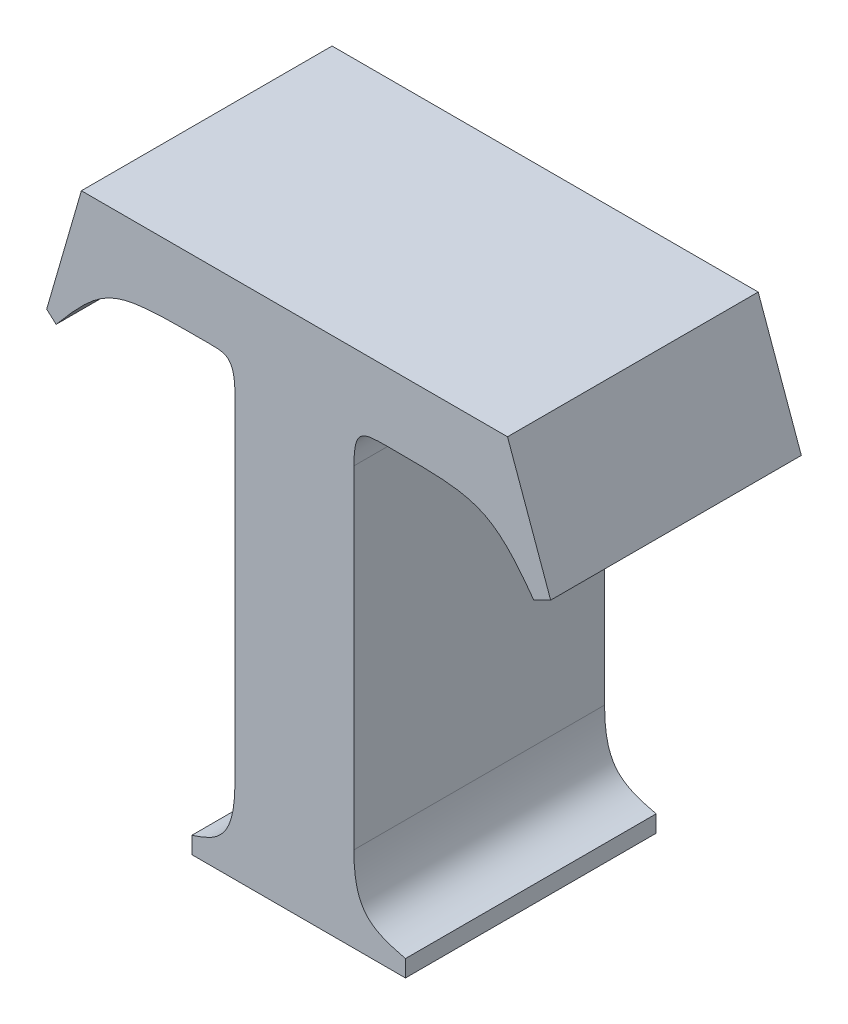
ISO-10303-21;
HEADER;
FILE_DESCRIPTION(('STEP AP214'),'2;1');
FILE_NAME('part.step','',(''),(''),'','','');
FILE_SCHEMA(('AUTOMOTIVE_DESIGN { 1 0 10303 214 1 1 1 1 }'));
ENDSEC;
DATA;
#1=APPLICATION_CONTEXT('core data for automotive mechanical design processes');
#2=APPLICATION_PROTOCOL_DEFINITION('international standard','automotive_design',2000,#1);
#3=PRODUCT_CONTEXT('',#1,'mechanical');
#4=PRODUCT('Part','Part','',(#3));
#5=PRODUCT_RELATED_PRODUCT_CATEGORY('part','',(#4));
#6=PRODUCT_DEFINITION_FORMATION('','',#4);
#7=PRODUCT_DEFINITION_CONTEXT('part definition',#1,'design');
#8=PRODUCT_DEFINITION('design','',#6,#7);
#9=PRODUCT_DEFINITION_SHAPE('','',#8);
#10=(LENGTH_UNIT() NAMED_UNIT(*) SI_UNIT(.MILLI.,.METRE.));
#11=(NAMED_UNIT(*) PLANE_ANGLE_UNIT() SI_UNIT($,.RADIAN.));
#12=(NAMED_UNIT(*) SI_UNIT($,.STERADIAN.) SOLID_ANGLE_UNIT());
#13=UNCERTAINTY_MEASURE_WITH_UNIT(LENGTH_MEASURE(1.E-05),#10,'distance_accuracy_value','');
#14=(GEOMETRIC_REPRESENTATION_CONTEXT(3) GLOBAL_UNCERTAINTY_ASSIGNED_CONTEXT((#13)) GLOBAL_UNIT_ASSIGNED_CONTEXT((#10,
#11,#12)) REPRESENTATION_CONTEXT('',''));
#15=CARTESIAN_POINT('',(0.,0.,0.));
#16=DIRECTION('',(0.,0.,1.));
#17=DIRECTION('',(1.,0.,0.));
#18=AXIS2_PLACEMENT_3D('',#15,#16,#17);
#19=CARTESIAN_POINT('',(2.798055078301,-0.28051607931998,0.));
#20=CARTESIAN_POINT('',(2.798055078301,-0.28051607931998,0.1));
#21=CARTESIAN_POINT('',(2.832051957863,-0.28051607931998,0.));
#22=CARTESIAN_POINT('',(2.832051957863,-0.28051607931998,0.1));
#23=CARTESIAN_POINT('',(2.838767232963,-0.28051607931998,0.));
#24=CARTESIAN_POINT('',(2.838767232963,-0.28051607931998,0.1));
#25=CARTESIAN_POINT('',(2.855976392692,-0.304439952646,0.));
#26=CARTESIAN_POINT('',(2.855976392692,-0.304439952646,0.1));
#27=B_SPLINE_SURFACE_WITH_KNOTS('',3,1,((#19,#20),(#21,#22),(#23,#24),(#25,#26)),.UNSPECIFIED.,
.F.,.F.,.F.,(4,4),(2,2),(-1.,0.),(0.,0.01),.UNSPECIFIED.);
#28=CARTESIAN_POINT('',(2.855976392692,-0.304439952646,0.));
#29=CARTESIAN_POINT('',(2.838767232963,-0.28051607931998,0.));
#30=CARTESIAN_POINT('',(2.832051957863,-0.28051607931998,0.));
#31=CARTESIAN_POINT('',(2.798055078301,-0.28051607931998,0.));
#32=B_SPLINE_CURVE_WITH_KNOTS('',3,(#28,#29,#30,#31),.UNSPECIFIED.,.F.,.F.,(4,4),(0.,1.),.UNSPECIFIED.);
#33=CARTESIAN_POINT('',(2.855976392692,-0.304439952646,0.));
#34=VERTEX_POINT('',#33);
#35=CARTESIAN_POINT('',(2.798055078301,-0.28051607931998,0.));
#36=VERTEX_POINT('',#35);
#37=EDGE_CURVE('E11',#34,#36,#32,.T.);
#38=DIRECTION('',(0.,0.,1.));
#39=VECTOR('',#38,1.);
#40=CARTESIAN_POINT('',(2.855976392692,-0.304439952646,0.));
#41=LINE('',#40,#39);
#42=CARTESIAN_POINT('',(2.855976392692,-0.304439952646,0.1));
#43=VERTEX_POINT('',#42);
#44=EDGE_CURVE('E28',#34,#43,#41,.T.);
#45=CARTESIAN_POINT('',(2.798055078301,-0.28051607931998,0.1));
#46=CARTESIAN_POINT('',(2.832051957863,-0.28051607931998,0.1));
#47=CARTESIAN_POINT('',(2.838767232963,-0.28051607931998,0.1));
#48=CARTESIAN_POINT('',(2.855976392692,-0.304439952646,0.1));
#49=B_SPLINE_CURVE_WITH_KNOTS('',3,(#45,#46,#47,#48),.UNSPECIFIED.,.F.,.F.,(4,4),(-1.,0.),.UNSPECIFIED.);
#50=CARTESIAN_POINT('',(2.798055078301,-0.28051607931998,0.1));
#51=VERTEX_POINT('',#50);
#52=EDGE_CURVE('E152',#51,#43,#49,.T.);
#53=DIRECTION('',(0.,0.,1.));
#54=VECTOR('',#53,1.);
#55=CARTESIAN_POINT('',(2.798055078301,-0.28051607931998,0.));
#56=LINE('',#55,#54);
#57=EDGE_CURVE('E304',#36,#51,#56,.T.);
#58=ORIENTED_EDGE('',*,*,#37,.F.);
#59=ORIENTED_EDGE('',*,*,#44,.T.);
#60=ORIENTED_EDGE('',*,*,#52,.F.);
#61=ORIENTED_EDGE('',*,*,#57,.F.);
#62=EDGE_LOOP('',(#58,#59,#60,#61));
#63=FACE_BOUND('',#62,.T.);
#64=ADVANCED_FACE('F17',(#63),#27,.T.);
#65=CARTESIAN_POINT('',(2.784204335989,-0.29394706624691,0.));
#66=CARTESIAN_POINT('',(2.784204335989,-0.29394706624691,0.1));
#67=CARTESIAN_POINT('',(2.784204335989,-0.280516079319981,0.));
#68=CARTESIAN_POINT('',(2.784204335989,-0.280516079319981,0.1));
#69=CARTESIAN_POINT('',(2.78756244146,-0.28051607931998,0.));
#70=CARTESIAN_POINT('',(2.78756244146,-0.28051607931998,0.1));
#71=CARTESIAN_POINT('',(2.798055078301,-0.28051607931998,0.));
#72=CARTESIAN_POINT('',(2.798055078301,-0.28051607931998,0.1));
#73=B_SPLINE_SURFACE_WITH_KNOTS('',3,1,((#65,#66),(#67,#68),(#69,#70),(#71,#72)),.UNSPECIFIED.,
.F.,.F.,.F.,(4,4),(2,2),(-1.,0.),(0.,0.01),.UNSPECIFIED.);
#74=CARTESIAN_POINT('',(2.798055078301,-0.28051607931998,0.));
#75=CARTESIAN_POINT('',(2.78756244146,-0.28051607931998,0.));
#76=CARTESIAN_POINT('',(2.784204335989,-0.280516079319981,0.));
#77=CARTESIAN_POINT('',(2.784204335989,-0.29394706624691,0.));
#78=B_SPLINE_CURVE_WITH_KNOTS('',3,(#74,#75,#76,#77),.UNSPECIFIED.,.F.,.F.,(4,4),(0.,1.),.UNSPECIFIED.);
#79=CARTESIAN_POINT('',(2.784204335989,-0.29394706624691,0.));
#80=VERTEX_POINT('',#79);
#81=EDGE_CURVE('E297',#36,#80,#78,.T.);
#82=CARTESIAN_POINT('',(2.784204335989,-0.29394706624691,0.1));
#83=CARTESIAN_POINT('',(2.784204335989,-0.280516079319981,0.1));
#84=CARTESIAN_POINT('',(2.78756244146,-0.28051607931998,0.1));
#85=CARTESIAN_POINT('',(2.798055078301,-0.28051607931998,0.1));
#86=B_SPLINE_CURVE_WITH_KNOTS('',3,(#82,#83,#84,#85),.UNSPECIFIED.,.F.,.F.,(4,4),(-1.,0.),.UNSPECIFIED.);
#87=CARTESIAN_POINT('',(2.784204335989,-0.29394706624691,0.1));
#88=VERTEX_POINT('',#87);
#89=EDGE_CURVE('E293',#88,#51,#86,.T.);
#90=DIRECTION('',(0.,0.,1.));
#91=VECTOR('',#90,1.);
#92=CARTESIAN_POINT('',(2.784204335989,-0.29394706624691,0.));
#93=LINE('',#92,#91);
#94=EDGE_CURVE('E290',#80,#88,#93,.T.);
#95=ORIENTED_EDGE('',*,*,#81,.F.);
#96=ORIENTED_EDGE('',*,*,#57,.T.);
#97=ORIENTED_EDGE('',*,*,#89,.F.);
#98=ORIENTED_EDGE('',*,*,#94,.F.);
#99=EDGE_LOOP('',(#95,#96,#97,#98));
#100=FACE_BOUND('',#99,.T.);
#101=ADVANCED_FACE('F366',(#100),#73,.T.);
#102=CARTESIAN_POINT('',(2.784204335989,-0.426577508445,0.));
#103=DIRECTION('',(1.,0.,0.));
#104=DIRECTION('',(0.,1.,0.));
#105=AXIS2_PLACEMENT_3D('',#102,#103,#104);
#106=PLANE('',#105);
#107=DIRECTION('',(0.,-1.,0.));
#108=VECTOR('',#107,1.);
#109=CARTESIAN_POINT('',(2.784204335989,-0.29394706624691,0.));
#110=LINE('',#109,#108);
#111=CARTESIAN_POINT('',(2.784204335989,-0.426577508445,0.));
#112=VERTEX_POINT('',#111);
#113=EDGE_CURVE('E288',#80,#112,#110,.T.);
#114=ORIENTED_EDGE('',*,*,#113,.F.);
#115=ORIENTED_EDGE('',*,*,#94,.T.);
#116=DIRECTION('',(0.,1.,0.));
#117=VECTOR('',#116,1.);
#118=CARTESIAN_POINT('',(2.784204335989,-0.29394706624691,0.1));
#119=LINE('',#118,#117);
#120=CARTESIAN_POINT('',(2.784204335989,-0.426577508445,0.1));
#121=VERTEX_POINT('',#120);
#122=EDGE_CURVE('E285',#121,#88,#119,.T.);
#123=ORIENTED_EDGE('',*,*,#122,.F.);
#124=DIRECTION('',(0.,0.,1.));
#125=VECTOR('',#124,1.);
#126=CARTESIAN_POINT('',(2.784204335989,-0.426577508445,0.));
#127=LINE('',#126,#125);
#128=EDGE_CURVE('E279',#112,#121,#127,.T.);
#129=ORIENTED_EDGE('',*,*,#128,.F.);
#130=EDGE_LOOP('',(#114,#115,#123,#129));
#131=FACE_BOUND('',#130,.T.);
#132=ADVANCED_FACE('F362',(#131),#106,.T.);
#133=CARTESIAN_POINT('',(2.804770353402,-0.453859050516,0.));
#134=CARTESIAN_POINT('',(2.804770353402,-0.453859050516,0.1));
#135=CARTESIAN_POINT('',(2.79091961109,-0.450501256992,0.));
#136=CARTESIAN_POINT('',(2.79091961109,-0.450501256992,0.1));
#137=CARTESIAN_POINT('',(2.784204335989,-0.447143557053,0.));
#138=CARTESIAN_POINT('',(2.784204335989,-0.447143557053,0.1));
#139=CARTESIAN_POINT('',(2.784204335989,-0.426577508445,0.));
#140=CARTESIAN_POINT('',(2.784204335989,-0.426577508445,0.1));
#141=B_SPLINE_SURFACE_WITH_KNOTS('',3,1,((#133,#134),(#135,#136),(#137,#138),(#139,#140)),
.UNSPECIFIED.,.F.,.F.,.F.,(4,4),(2,2),(-1.,0.),(0.,0.01),.UNSPECIFIED.);
#142=CARTESIAN_POINT('',(2.784204335989,-0.426577508445,0.));
#143=CARTESIAN_POINT('',(2.784204335989,-0.447143557053,0.));
#144=CARTESIAN_POINT('',(2.79091961109,-0.450501256992,0.));
#145=CARTESIAN_POINT('',(2.804770353402,-0.453859050516,0.));
#146=B_SPLINE_CURVE_WITH_KNOTS('',3,(#142,#143,#144,#145),.UNSPECIFIED.,.F.,.F.,(4,4),(0.,1.),.UNSPECIFIED.);
#147=CARTESIAN_POINT('',(2.804770353402,-0.453859050516,0.));
#148=VERTEX_POINT('',#147);
#149=EDGE_CURVE('E272',#112,#148,#146,.T.);
#150=CARTESIAN_POINT('',(2.804770353402,-0.453859050516,0.1));
#151=CARTESIAN_POINT('',(2.79091961109,-0.450501256992,0.1));
#152=CARTESIAN_POINT('',(2.784204335989,-0.447143557053,0.1));
#153=CARTESIAN_POINT('',(2.784204335989,-0.426577508445,0.1));
#154=B_SPLINE_CURVE_WITH_KNOTS('',3,(#150,#151,#152,#153),.UNSPECIFIED.,.F.,.F.,(4,4),(-1.,0.),.UNSPECIFIED.);
#155=CARTESIAN_POINT('',(2.804770353402,-0.453859050516,0.1));
#156=VERTEX_POINT('',#155);
#157=EDGE_CURVE('E267',#156,#121,#154,.T.);
#158=DIRECTION('',(0.,0.,1.));
#159=VECTOR('',#158,1.);
#160=CARTESIAN_POINT('',(2.804770353402,-0.453859050516,0.));
#161=LINE('',#160,#159);
#162=EDGE_CURVE('E264',#148,#156,#161,.T.);
#163=ORIENTED_EDGE('',*,*,#149,.F.);
#164=ORIENTED_EDGE('',*,*,#128,.T.);
#165=ORIENTED_EDGE('',*,*,#157,.F.);
#166=ORIENTED_EDGE('',*,*,#162,.F.);
#167=EDGE_LOOP('',(#163,#164,#165,#166));
#168=FACE_BOUND('',#167,.T.);
#169=ADVANCED_FACE('F358',(#168),#141,.T.);
#170=CARTESIAN_POINT('',(2.804770353402,-0.46057454398,0.));
#171=DIRECTION('',(1.,0.,0.));
#172=DIRECTION('',(0.,1.,0.));
#173=AXIS2_PLACEMENT_3D('',#170,#171,#172);
#174=PLANE('',#173);
#175=DIRECTION('',(0.,-1.,0.));
#176=VECTOR('',#175,1.);
#177=CARTESIAN_POINT('',(2.804770353402,-0.453859050516,0.));
#178=LINE('',#177,#176);
#179=CARTESIAN_POINT('',(2.804770353402,-0.46057454398,0.));
#180=VERTEX_POINT('',#179);
#181=EDGE_CURVE('E262',#148,#180,#178,.T.);
#182=ORIENTED_EDGE('',*,*,#181,.F.);
#183=ORIENTED_EDGE('',*,*,#162,.T.);
#184=DIRECTION('',(0.,1.,0.));
#185=VECTOR('',#184,1.);
#186=CARTESIAN_POINT('',(2.804770353402,-0.453859050516,0.1));
#187=LINE('',#186,#185);
#188=CARTESIAN_POINT('',(2.804770353402,-0.46057454398,0.1));
#189=VERTEX_POINT('',#188);
#190=EDGE_CURVE('E259',#189,#156,#187,.T.);
#191=ORIENTED_EDGE('',*,*,#190,.F.);
#192=DIRECTION('',(0.,0.,1.));
#193=VECTOR('',#192,1.);
#194=CARTESIAN_POINT('',(2.804770353402,-0.46057454398,0.));
#195=LINE('',#194,#193);
#196=EDGE_CURVE('E256',#180,#189,#195,.T.);
#197=ORIENTED_EDGE('',*,*,#196,.F.);
#198=EDGE_LOOP('',(#182,#183,#191,#197));
#199=FACE_BOUND('',#198,.T.);
#200=ADVANCED_FACE('F354',(#199),#174,.T.);
#201=CARTESIAN_POINT('',(2.719568682337,-0.46057454398,0.));
#202=DIRECTION('',(0.,-1.,0.));
#203=DIRECTION('',(1.,0.,0.));
#204=AXIS2_PLACEMENT_3D('',#201,#202,#203);
#205=PLANE('',#204);
#206=DIRECTION('',(-1.,0.,0.));
#207=VECTOR('',#206,1.);
#208=CARTESIAN_POINT('',(2.804770353402,-0.46057454398,0.));
#209=LINE('',#208,#207);
#210=CARTESIAN_POINT('',(2.719568682337,-0.46057454398,0.));
#211=VERTEX_POINT('',#210);
#212=EDGE_CURVE('E254',#180,#211,#209,.T.);
#213=ORIENTED_EDGE('',*,*,#212,.F.);
#214=ORIENTED_EDGE('',*,*,#196,.T.);
#215=DIRECTION('',(1.,0.,0.));
#216=VECTOR('',#215,1.);
#217=CARTESIAN_POINT('',(2.804770353402,-0.46057454398,0.1));
#218=LINE('',#217,#216);
#219=CARTESIAN_POINT('',(2.719568682337,-0.46057454398,0.1));
#220=VERTEX_POINT('',#219);
#221=EDGE_CURVE('E251',#220,#189,#218,.T.);
#222=ORIENTED_EDGE('',*,*,#221,.F.);
#223=DIRECTION('',(0.,0.,1.));
#224=VECTOR('',#223,1.);
#225=CARTESIAN_POINT('',(2.719568682337,-0.46057454398,0.));
#226=LINE('',#225,#224);
#227=EDGE_CURVE('E248',#211,#220,#226,.T.);
#228=ORIENTED_EDGE('',*,*,#227,.F.);
#229=EDGE_LOOP('',(#213,#214,#222,#228));
#230=FACE_BOUND('',#229,.T.);
#231=ADVANCED_FACE('F350',(#230),#205,.T.);
#232=CARTESIAN_POINT('',(2.719568682337,-0.453859050516,0.));
#233=DIRECTION('',(-1.,0.,0.));
#234=DIRECTION('',(0.,-1.,0.));
#235=AXIS2_PLACEMENT_3D('',#232,#233,#234);
#236=PLANE('',#235);
#237=DIRECTION('',(0.,1.,0.));
#238=VECTOR('',#237,1.);
#239=CARTESIAN_POINT('',(2.719568682337,-0.46057454398,0.));
#240=LINE('',#239,#238);
#241=CARTESIAN_POINT('',(2.719568682337,-0.453859050516,0.));
#242=VERTEX_POINT('',#241);
#243=EDGE_CURVE('E246',#211,#242,#240,.T.);
#244=ORIENTED_EDGE('',*,*,#243,.F.);
#245=ORIENTED_EDGE('',*,*,#227,.T.);
#246=DIRECTION('',(0.,-1.,0.));
#247=VECTOR('',#246,1.);
#248=CARTESIAN_POINT('',(2.719568682337,-0.46057454398,0.1));
#249=LINE('',#248,#247);
#250=CARTESIAN_POINT('',(2.719568682337,-0.453859050516,0.1));
#251=VERTEX_POINT('',#250);
#252=EDGE_CURVE('E243',#251,#220,#249,.T.);
#253=ORIENTED_EDGE('',*,*,#252,.F.);
#254=DIRECTION('',(0.,0.,1.));
#255=VECTOR('',#254,1.);
#256=CARTESIAN_POINT('',(2.719568682337,-0.453859050516,0.));
#257=LINE('',#256,#255);
#258=EDGE_CURVE('E237',#242,#251,#257,.T.);
#259=ORIENTED_EDGE('',*,*,#258,.F.);
#260=EDGE_LOOP('',(#244,#245,#253,#259));
#261=FACE_BOUND('',#260,.T.);
#262=ADVANCED_FACE('F346',(#261),#236,.T.);
#263=CARTESIAN_POINT('',(2.73677659428,-0.426577508445,0.));
#264=CARTESIAN_POINT('',(2.73677659428,-0.426577508445,0.1));
#265=CARTESIAN_POINT('',(2.73677659428,-0.447143557053,0.));
#266=CARTESIAN_POINT('',(2.73677659428,-0.447143557053,0.1));
#267=CARTESIAN_POINT('',(2.730061319179,-0.450501256992,0.));
#268=CARTESIAN_POINT('',(2.730061319179,-0.450501256992,0.1));
#269=CARTESIAN_POINT('',(2.719568682337,-0.453859050516,0.));
#270=CARTESIAN_POINT('',(2.719568682337,-0.453859050516,0.1));
#271=B_SPLINE_SURFACE_WITH_KNOTS('',3,1,((#263,#264),(#265,#266),(#267,#268),(#269,#270)),
.UNSPECIFIED.,.F.,.F.,.F.,(4,4),(2,2),(-1.,0.),(0.,0.01),.UNSPECIFIED.);
#272=CARTESIAN_POINT('',(2.719568682337,-0.453859050516,0.));
#273=CARTESIAN_POINT('',(2.730061319179,-0.450501256992,0.));
#274=CARTESIAN_POINT('',(2.73677659428,-0.447143557053,0.));
#275=CARTESIAN_POINT('',(2.73677659428,-0.426577508445,0.));
#276=B_SPLINE_CURVE_WITH_KNOTS('',3,(#272,#273,#274,#275),.UNSPECIFIED.,.F.,.F.,(4,4),(0.,1.),.UNSPECIFIED.);
#277=CARTESIAN_POINT('',(2.73677659428,-0.426577508445,0.));
#278=VERTEX_POINT('',#277);
#279=EDGE_CURVE('E230',#242,#278,#276,.T.);
#280=CARTESIAN_POINT('',(2.73677659428,-0.426577508445,0.1));
#281=CARTESIAN_POINT('',(2.73677659428,-0.447143557053,0.1));
#282=CARTESIAN_POINT('',(2.730061319179,-0.450501256992,0.1));
#283=CARTESIAN_POINT('',(2.719568682337,-0.453859050516,0.1));
#284=B_SPLINE_CURVE_WITH_KNOTS('',3,(#280,#281,#282,#283),.UNSPECIFIED.,.F.,.F.,(4,4),(-1.,0.),.UNSPECIFIED.);
#285=CARTESIAN_POINT('',(2.73677659428,-0.426577508445,0.1));
#286=VERTEX_POINT('',#285);
#287=EDGE_CURVE('E225',#286,#251,#284,.T.);
#288=DIRECTION('',(0.,0.,1.));
#289=VECTOR('',#288,1.);
#290=CARTESIAN_POINT('',(2.73677659428,-0.426577508445,0.));
#291=LINE('',#290,#289);
#292=EDGE_CURVE('E222',#278,#286,#291,.T.);
#293=ORIENTED_EDGE('',*,*,#279,.F.);
#294=ORIENTED_EDGE('',*,*,#258,.T.);
#295=ORIENTED_EDGE('',*,*,#287,.F.);
#296=ORIENTED_EDGE('',*,*,#292,.F.);
#297=EDGE_LOOP('',(#293,#294,#295,#296));
#298=FACE_BOUND('',#297,.T.);
#299=ADVANCED_FACE('F342',(#298),#271,.T.);
#300=CARTESIAN_POINT('',(2.73677659428,-0.29394706624691,0.));
#301=DIRECTION('',(-1.,0.,0.));
#302=DIRECTION('',(0.,-1.,0.));
#303=AXIS2_PLACEMENT_3D('',#300,#301,#302);
#304=PLANE('',#303);
#305=DIRECTION('',(0.,1.,0.));
#306=VECTOR('',#305,1.);
#307=CARTESIAN_POINT('',(2.73677659428,-0.426577508445,0.));
#308=LINE('',#307,#306);
#309=CARTESIAN_POINT('',(2.73677659428,-0.29394706624691,0.));
#310=VERTEX_POINT('',#309);
#311=EDGE_CURVE('E220',#278,#310,#308,.T.);
#312=ORIENTED_EDGE('',*,*,#311,.F.);
#313=ORIENTED_EDGE('',*,*,#292,.T.);
#314=DIRECTION('',(0.,-1.,0.));
#315=VECTOR('',#314,1.);
#316=CARTESIAN_POINT('',(2.73677659428,-0.426577508445,0.1));
#317=LINE('',#316,#315);
#318=CARTESIAN_POINT('',(2.73677659428,-0.29394706624691,0.1));
#319=VERTEX_POINT('',#318);
#320=EDGE_CURVE('E217',#319,#286,#317,.T.);
#321=ORIENTED_EDGE('',*,*,#320,.F.);
#322=DIRECTION('',(0.,0.,1.));
#323=VECTOR('',#322,1.);
#324=CARTESIAN_POINT('',(2.73677659428,-0.29394706624691,0.));
#325=LINE('',#324,#323);
#326=EDGE_CURVE('E211',#310,#319,#325,.T.);
#327=ORIENTED_EDGE('',*,*,#326,.F.);
#328=EDGE_LOOP('',(#312,#313,#321,#327));
#329=FACE_BOUND('',#328,.T.);
#330=ADVANCED_FACE('F338',(#329),#304,.T.);
#331=CARTESIAN_POINT('',(2.726283957438,-0.28051607931998,0.));
#332=CARTESIAN_POINT('',(2.726283957438,-0.28051607931998,0.1));
#333=CARTESIAN_POINT('',(2.733419424649,-0.28051607931998,0.));
#334=CARTESIAN_POINT('',(2.733419424649,-0.28051607931998,0.1));
#335=CARTESIAN_POINT('',(2.73677659428,-0.28051607931998,0.));
#336=CARTESIAN_POINT('',(2.73677659428,-0.28051607931998,0.1));
#337=CARTESIAN_POINT('',(2.73677659428,-0.29394706624691,0.));
#338=CARTESIAN_POINT('',(2.73677659428,-0.29394706624691,0.1));
#339=B_SPLINE_SURFACE_WITH_KNOTS('',3,1,((#331,#332),(#333,#334),(#335,#336),(#337,#338)),
.UNSPECIFIED.,.F.,.F.,.F.,(4,4),(2,2),(-1.,0.),(0.,0.01),.UNSPECIFIED.);
#340=CARTESIAN_POINT('',(2.73677659428,-0.29394706624691,0.));
#341=CARTESIAN_POINT('',(2.73677659428,-0.28051607931998,0.));
#342=CARTESIAN_POINT('',(2.733419424649,-0.28051607931998,0.));
#343=CARTESIAN_POINT('',(2.726283957438,-0.28051607931998,0.));
#344=B_SPLINE_CURVE_WITH_KNOTS('',3,(#340,#341,#342,#343),.UNSPECIFIED.,.F.,.F.,(4,4),(0.,1.),.UNSPECIFIED.);
#345=CARTESIAN_POINT('',(2.726283957438,-0.28051607931998,0.));
#346=VERTEX_POINT('',#345);
#347=EDGE_CURVE('E204',#310,#346,#344,.T.);
#348=CARTESIAN_POINT('',(2.726283957438,-0.28051607931998,0.1));
#349=CARTESIAN_POINT('',(2.733419424649,-0.28051607931998,0.1));
#350=CARTESIAN_POINT('',(2.73677659428,-0.28051607931998,0.1));
#351=CARTESIAN_POINT('',(2.73677659428,-0.29394706624691,0.1));
#352=B_SPLINE_CURVE_WITH_KNOTS('',3,(#348,#349,#350,#351),.UNSPECIFIED.,.F.,.F.,(4,4),(-1.,0.),.UNSPECIFIED.);
#353=CARTESIAN_POINT('',(2.726283957438,-0.28051607931998,0.1));
#354=VERTEX_POINT('',#353);
#355=EDGE_CURVE('E199',#354,#319,#352,.T.);
#356=DIRECTION('',(0.,0.,1.));
#357=VECTOR('',#356,1.);
#358=CARTESIAN_POINT('',(2.726283957438,-0.28051607931998,0.));
#359=LINE('',#358,#357);
#360=EDGE_CURVE('E193',#346,#354,#359,.T.);
#361=ORIENTED_EDGE('',*,*,#347,.F.);
#362=ORIENTED_EDGE('',*,*,#326,.T.);
#363=ORIENTED_EDGE('',*,*,#355,.F.);
#364=ORIENTED_EDGE('',*,*,#360,.F.);
#365=EDGE_LOOP('',(#361,#362,#363,#364));
#366=FACE_BOUND('',#365,.T.);
#367=ADVANCED_FACE('F334',(#366),#339,.T.);
#368=CARTESIAN_POINT('',(2.665424417741,-0.304439952646,0.));
#369=CARTESIAN_POINT('',(2.665424417741,-0.304439952646,0.1));
#370=CARTESIAN_POINT('',(2.685571802776,-0.28051607931998,0.));
#371=CARTESIAN_POINT('',(2.685571802776,-0.28051607931998,0.1));
#372=CARTESIAN_POINT('',(2.688928972407,-0.28051607931998,0.));
#373=CARTESIAN_POINT('',(2.688928972407,-0.28051607931998,0.1));
#374=CARTESIAN_POINT('',(2.726283957438,-0.28051607931998,0.));
#375=CARTESIAN_POINT('',(2.726283957438,-0.28051607931998,0.1));
#376=B_SPLINE_SURFACE_WITH_KNOTS('',3,1,((#368,#369),(#370,#371),(#372,#373),(#374,#375)),
.UNSPECIFIED.,.F.,.F.,.F.,(4,4),(2,2),(-1.,0.),(0.,0.01),.UNSPECIFIED.);
#377=CARTESIAN_POINT('',(2.726283957438,-0.28051607931998,0.));
#378=CARTESIAN_POINT('',(2.688928972407,-0.28051607931998,0.));
#379=CARTESIAN_POINT('',(2.685571802776,-0.28051607931998,0.));
#380=CARTESIAN_POINT('',(2.665424417741,-0.304439952646,0.));
#381=B_SPLINE_CURVE_WITH_KNOTS('',3,(#377,#378,#379,#380),.UNSPECIFIED.,.F.,.F.,(4,4),(0.,1.),.UNSPECIFIED.);
#382=CARTESIAN_POINT('',(2.665424417741,-0.304439952646,0.));
#383=VERTEX_POINT('',#382);
#384=EDGE_CURVE('E186',#346,#383,#381,.T.);
#385=CARTESIAN_POINT('',(2.665424417741,-0.304439952646,0.1));
#386=CARTESIAN_POINT('',(2.685571802776,-0.28051607931998,0.1));
#387=CARTESIAN_POINT('',(2.688928972407,-0.28051607931998,0.1));
#388=CARTESIAN_POINT('',(2.726283957438,-0.28051607931998,0.1));
#389=B_SPLINE_CURVE_WITH_KNOTS('',3,(#385,#386,#387,#388),.UNSPECIFIED.,.F.,.F.,(4,4),(-1.,0.),.UNSPECIFIED.);
#390=CARTESIAN_POINT('',(2.665424417741,-0.304439952646,0.1));
#391=VERTEX_POINT('',#390);
#392=EDGE_CURVE('E181',#391,#354,#389,.T.);
#393=DIRECTION('',(0.,0.,1.));
#394=VECTOR('',#393,1.);
#395=CARTESIAN_POINT('',(2.665424417741,-0.304439952646,0.));
#396=LINE('',#395,#394);
#397=EDGE_CURVE('E178',#383,#391,#396,.T.);
#398=ORIENTED_EDGE('',*,*,#384,.F.);
#399=ORIENTED_EDGE('',*,*,#360,.T.);
#400=ORIENTED_EDGE('',*,*,#392,.F.);
#401=ORIENTED_EDGE('',*,*,#397,.F.);
#402=EDGE_LOOP('',(#398,#399,#400,#401));
#403=FACE_BOUND('',#402,.T.);
#404=ADVANCED_FACE('F330',(#403),#376,.T.);
#405=CARTESIAN_POINT('',(2.661647367946,-0.301082252706,0.));
#406=DIRECTION('',(-0.664399468795153,-0.747377646083102,0.));
#407=DIRECTION('',(0.747377646083102,-0.664399468795153,0.));
#408=AXIS2_PLACEMENT_3D('',#405,#406,#407);
#409=PLANE('',#408);
#410=DIRECTION('',(-0.747377646083102,0.664399468795153,0.));
#411=VECTOR('',#410,1.);
#412=CARTESIAN_POINT('',(2.665424417741,-0.304439952646,0.));
#413=LINE('',#412,#411);
#414=CARTESIAN_POINT('',(2.661647367946,-0.301082252706,0.));
#415=VERTEX_POINT('',#414);
#416=EDGE_CURVE('E176',#383,#415,#413,.T.);
#417=ORIENTED_EDGE('',*,*,#416,.F.);
#418=ORIENTED_EDGE('',*,*,#397,.T.);
#419=DIRECTION('',(0.747377646083102,-0.664399468795153,0.));
#420=VECTOR('',#419,1.);
#421=CARTESIAN_POINT('',(2.665424417741,-0.304439952646,0.1));
#422=LINE('',#421,#420);
#423=CARTESIAN_POINT('',(2.661647367946,-0.301082252706,0.1));
#424=VERTEX_POINT('',#423);
#425=EDGE_CURVE('E173',#424,#391,#422,.T.);
#426=ORIENTED_EDGE('',*,*,#425,.F.);
#427=DIRECTION('',(0.,0.,1.));
#428=VECTOR('',#427,1.);
#429=CARTESIAN_POINT('',(2.661647367946,-0.301082252706,0.));
#430=LINE('',#429,#428);
#431=EDGE_CURVE('E170',#415,#424,#430,.T.);
#432=ORIENTED_EDGE('',*,*,#431,.F.);
#433=EDGE_LOOP('',(#417,#418,#426,#432));
#434=FACE_BOUND('',#433,.T.);
#435=ADVANCED_FACE('F326',(#434),#409,.T.);
#436=CARTESIAN_POINT('',(2.675498110258,-0.25323453724898,0.));
#437=DIRECTION('',(-0.960563793427831,0.278059703580967,0.));
#438=DIRECTION('',(-0.278059703580967,-0.960563793427831,0.));
#439=AXIS2_PLACEMENT_3D('',#436,#437,#438);
#440=PLANE('',#439);
#441=DIRECTION('',(0.278059703580967,0.960563793427831,0.));
#442=VECTOR('',#441,1.);
#443=CARTESIAN_POINT('',(2.661647367946,-0.301082252706,0.));
#444=LINE('',#443,#442);
#445=CARTESIAN_POINT('',(2.675498110258,-0.25323453724898,0.));
#446=VERTEX_POINT('',#445);
#447=EDGE_CURVE('E168',#415,#446,#444,.T.);
#448=ORIENTED_EDGE('',*,*,#447,.F.);
#449=ORIENTED_EDGE('',*,*,#431,.T.);
#450=DIRECTION('',(-0.278059703580967,-0.960563793427831,0.));
#451=VECTOR('',#450,1.);
#452=CARTESIAN_POINT('',(2.661647367946,-0.301082252706,0.1));
#453=LINE('',#452,#451);
#454=CARTESIAN_POINT('',(2.675498110258,-0.25323453724898,0.1));
#455=VERTEX_POINT('',#454);
#456=EDGE_CURVE('E165',#455,#424,#453,.T.);
#457=ORIENTED_EDGE('',*,*,#456,.F.);
#458=DIRECTION('',(0.,0.,1.));
#459=VECTOR('',#458,1.);
#460=CARTESIAN_POINT('',(2.675498110258,-0.25323453724898,0.));
#461=LINE('',#460,#459);
#462=EDGE_CURVE('E162',#446,#455,#461,.T.);
#463=ORIENTED_EDGE('',*,*,#462,.F.);
#464=EDGE_LOOP('',(#448,#449,#457,#463));
#465=FACE_BOUND('',#464,.T.);
#466=ADVANCED_FACE('F322',(#465),#440,.T.);
#467=CARTESIAN_POINT('',(2.845483755851,-0.25323453724898,0.));
#468=DIRECTION('',(0.,1.,0.));
#469=DIRECTION('',(-1.,0.,0.));
#470=AXIS2_PLACEMENT_3D('',#467,#468,#469);
#471=PLANE('',#470);
#472=DIRECTION('',(1.,0.,0.));
#473=VECTOR('',#472,1.);
#474=CARTESIAN_POINT('',(2.675498110258,-0.25323453724898,0.));
#475=LINE('',#474,#473);
#476=CARTESIAN_POINT('',(2.845483755851,-0.25323453724898,0.));
#477=VERTEX_POINT('',#476);
#478=EDGE_CURVE('E160',#446,#477,#475,.T.);
#479=ORIENTED_EDGE('',*,*,#478,.F.);
#480=ORIENTED_EDGE('',*,*,#462,.T.);
#481=DIRECTION('',(-1.,0.,0.));
#482=VECTOR('',#481,1.);
#483=CARTESIAN_POINT('',(2.675498110258,-0.25323453724898,0.1));
#484=LINE('',#483,#482);
#485=CARTESIAN_POINT('',(2.845483755851,-0.25323453724898,0.1));
#486=VERTEX_POINT('',#485);
#487=EDGE_CURVE('E158',#486,#455,#484,.T.);
#488=ORIENTED_EDGE('',*,*,#487,.F.);
#489=DIRECTION('',(0.,0.,1.));
#490=VECTOR('',#489,1.);
#491=CARTESIAN_POINT('',(2.845483755851,-0.25323453724898,0.));
#492=LINE('',#491,#490);
#493=EDGE_CURVE('E137',#477,#486,#492,.T.);
#494=ORIENTED_EDGE('',*,*,#493,.F.);
#495=EDGE_LOOP('',(#479,#480,#488,#494));
#496=FACE_BOUND('',#495,.T.);
#497=ADVANCED_FACE('F320',(#496),#471,.T.);
#498=CARTESIAN_POINT('',(2.862691667793,-0.301082252706,0.));
#499=DIRECTION('',(0.940995578594808,0.338418854476258,0.));
#500=DIRECTION('',(-0.338418854476258,0.940995578594808,0.));
#501=AXIS2_PLACEMENT_3D('',#498,#499,#500);
#502=PLANE('',#501);
#503=DIRECTION('',(0.338418854476258,-0.940995578594808,0.));
#504=VECTOR('',#503,1.);
#505=CARTESIAN_POINT('',(2.845483755851,-0.25323453724898,0.));
#506=LINE('',#505,#504);
#507=CARTESIAN_POINT('',(2.862691667793,-0.301082252706,0.));
#508=VERTEX_POINT('',#507);
#509=EDGE_CURVE('E141',#477,#508,#506,.T.);
#510=ORIENTED_EDGE('',*,*,#509,.F.);
#511=ORIENTED_EDGE('',*,*,#493,.T.);
#512=DIRECTION('',(-0.338418854476258,0.940995578594808,0.));
#513=VECTOR('',#512,1.);
#514=CARTESIAN_POINT('',(2.845483755851,-0.25323453724898,0.1));
#515=LINE('',#514,#513);
#516=CARTESIAN_POINT('',(2.862691667793,-0.301082252706,0.1));
#517=VERTEX_POINT('',#516);
#518=EDGE_CURVE('E130',#517,#486,#515,.T.);
#519=ORIENTED_EDGE('',*,*,#518,.F.);
#520=DIRECTION('',(0.,0.,1.));
#521=VECTOR('',#520,1.);
#522=CARTESIAN_POINT('',(2.862691667793,-0.301082252706,0.));
#523=LINE('',#522,#521);
#524=EDGE_CURVE('E134',#508,#517,#523,.T.);
#525=ORIENTED_EDGE('',*,*,#524,.F.);
#526=EDGE_LOOP('',(#510,#511,#519,#525));
#527=FACE_BOUND('',#526,.T.);
#528=ADVANCED_FACE('F133',(#527),#502,.T.);
#529=CARTESIAN_POINT('',(2.855976392692,-0.304439952646,0.));
#530=DIRECTION('',(0.447220243335315,-0.894423867051356,0.));
#531=DIRECTION('',(0.894423867051356,0.447220243335315,0.));
#532=AXIS2_PLACEMENT_3D('',#529,#530,#531);
#533=PLANE('',#532);
#534=DIRECTION('',(-0.894423867051356,-0.447220243335315,0.));
#535=VECTOR('',#534,1.);
#536=CARTESIAN_POINT('',(2.862691667793,-0.301082252706,0.));
#537=LINE('',#536,#535);
#538=EDGE_CURVE('E147',#508,#34,#537,.T.);
#539=ORIENTED_EDGE('',*,*,#538,.F.);
#540=ORIENTED_EDGE('',*,*,#524,.T.);
#541=DIRECTION('',(0.894423867051356,0.447220243335315,0.));
#542=VECTOR('',#541,1.);
#543=CARTESIAN_POINT('',(2.862691667793,-0.301082252706,0.1));
#544=LINE('',#543,#542);
#545=EDGE_CURVE('E146',#43,#517,#544,.T.);
#546=ORIENTED_EDGE('',*,*,#545,.F.);
#547=ORIENTED_EDGE('',*,*,#44,.F.);
#548=EDGE_LOOP('',(#539,#540,#546,#547));
#549=FACE_BOUND('',#548,.T.);
#550=ADVANCED_FACE('F145',(#549),#533,.T.);
#551=CARTESIAN_POINT('',(2.761397292248,-0.33298369379393,0.));
#552=DIRECTION('',(0.,0.,1.));
#553=DIRECTION('',(1.,0.,0.));
#554=AXIS2_PLACEMENT_3D('',#551,#552,#553);
#555=PLANE('',#554);
#556=ORIENTED_EDGE('',*,*,#538,.T.);
#557=ORIENTED_EDGE('',*,*,#37,.T.);
#558=ORIENTED_EDGE('',*,*,#81,.T.);
#559=ORIENTED_EDGE('',*,*,#113,.T.);
#560=ORIENTED_EDGE('',*,*,#149,.T.);
#561=ORIENTED_EDGE('',*,*,#181,.T.);
#562=ORIENTED_EDGE('',*,*,#212,.T.);
#563=ORIENTED_EDGE('',*,*,#243,.T.);
#564=ORIENTED_EDGE('',*,*,#279,.T.);
#565=ORIENTED_EDGE('',*,*,#311,.T.);
#566=ORIENTED_EDGE('',*,*,#347,.T.);
#567=ORIENTED_EDGE('',*,*,#384,.T.);
#568=ORIENTED_EDGE('',*,*,#416,.T.);
#569=ORIENTED_EDGE('',*,*,#447,.T.);
#570=ORIENTED_EDGE('',*,*,#478,.T.);
#571=ORIENTED_EDGE('',*,*,#509,.T.);
#572=EDGE_LOOP('',(#556,#557,#558,#559,#560,#561,#562,#563,#564,#565,#566,#567,#568,#569,#570,#571));
#573=FACE_BOUND('',#572,.T.);
#574=ADVANCED_FACE('F315',(#573),#555,.F.);
#575=CARTESIAN_POINT('',(2.761397292248,-0.33298369379393,0.1));
#576=DIRECTION('',(0.,0.,1.));
#577=DIRECTION('',(1.,0.,0.));
#578=AXIS2_PLACEMENT_3D('',#575,#576,#577);
#579=PLANE('',#578);
#580=ORIENTED_EDGE('',*,*,#545,.T.);
#581=ORIENTED_EDGE('',*,*,#518,.T.);
#582=ORIENTED_EDGE('',*,*,#487,.T.);
#583=ORIENTED_EDGE('',*,*,#456,.T.);
#584=ORIENTED_EDGE('',*,*,#425,.T.);
#585=ORIENTED_EDGE('',*,*,#392,.T.);
#586=ORIENTED_EDGE('',*,*,#355,.T.);
#587=ORIENTED_EDGE('',*,*,#320,.T.);
#588=ORIENTED_EDGE('',*,*,#287,.T.);
#589=ORIENTED_EDGE('',*,*,#252,.T.);
#590=ORIENTED_EDGE('',*,*,#221,.T.);
#591=ORIENTED_EDGE('',*,*,#190,.T.);
#592=ORIENTED_EDGE('',*,*,#157,.T.);
#593=ORIENTED_EDGE('',*,*,#122,.T.);
#594=ORIENTED_EDGE('',*,*,#89,.T.);
#595=ORIENTED_EDGE('',*,*,#52,.T.);
#596=EDGE_LOOP('',(#580,#581,#582,#583,#584,#585,#586,#587,#588,#589,#590,#591,#592,#593,#594,#595));
#597=FACE_BOUND('',#596,.T.);
#598=ADVANCED_FACE('F150',(#597),#579,.T.);
#599=CLOSED_SHELL('',(#64,#101,#132,#169,#200,#231,#262,#299,#330,#367,#404,#435,#466,#497,#528,
#550,#574,#598));
#600=MANIFOLD_SOLID_BREP('B1',#599);
#601=ADVANCED_BREP_SHAPE_REPRESENTATION('',(#18,#600),#14);
#602=SHAPE_DEFINITION_REPRESENTATION(#9,#601);
ENDSEC;
END-ISO-10303-21;
